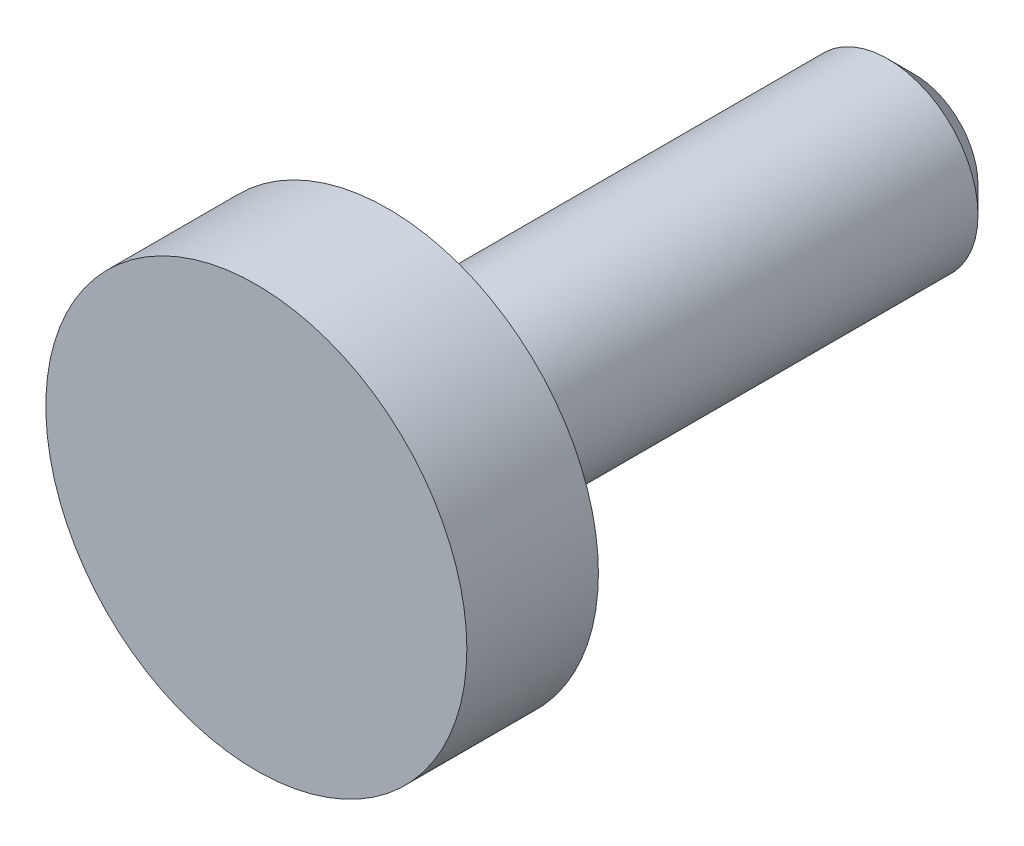
ISO-10303-21;
HEADER;
FILE_DESCRIPTION(('STEP AP214'),'2;1');
FILE_NAME('part.step','',(''),(''),'','','');
FILE_SCHEMA(('AUTOMOTIVE_DESIGN { 1 0 10303 214 1 1 1 1 }'));
ENDSEC;
DATA;
#1=APPLICATION_CONTEXT('core data for automotive mechanical design processes');
#2=APPLICATION_PROTOCOL_DEFINITION('international standard','automotive_design',2000,#1);
#3=PRODUCT_CONTEXT('',#1,'mechanical');
#4=PRODUCT('Part','Part','',(#3));
#5=PRODUCT_RELATED_PRODUCT_CATEGORY('part','',(#4));
#6=PRODUCT_DEFINITION_FORMATION('','',#4);
#7=PRODUCT_DEFINITION_CONTEXT('part definition',#1,'design');
#8=PRODUCT_DEFINITION('design','',#6,#7);
#9=PRODUCT_DEFINITION_SHAPE('','',#8);
#10=(LENGTH_UNIT() NAMED_UNIT(*) SI_UNIT(.MILLI.,.METRE.));
#11=(NAMED_UNIT(*) PLANE_ANGLE_UNIT() SI_UNIT($,.RADIAN.));
#12=(NAMED_UNIT(*) SI_UNIT($,.STERADIAN.) SOLID_ANGLE_UNIT());
#13=UNCERTAINTY_MEASURE_WITH_UNIT(LENGTH_MEASURE(1.E-05),#10,'distance_accuracy_value','');
#14=(GEOMETRIC_REPRESENTATION_CONTEXT(3) GLOBAL_UNCERTAINTY_ASSIGNED_CONTEXT((#13)) GLOBAL_UNIT_ASSIGNED_CONTEXT((#10,
#11,#12)) REPRESENTATION_CONTEXT('',''));
#15=CARTESIAN_POINT('',(0.,0.,0.));
#16=DIRECTION('',(0.,0.,1.));
#17=DIRECTION('',(1.,0.,0.));
#18=AXIS2_PLACEMENT_3D('',#15,#16,#17);
#19=CARTESIAN_POINT('',(0.,0.,20.));
#20=DIRECTION('',(0.,0.,-1.));
#21=DIRECTION('',(-1.,0.,0.));
#22=AXIS2_PLACEMENT_3D('',#19,#20,#21);
#23=CYLINDRICAL_SURFACE('',#22,3.425);
#24=CARTESIAN_POINT('',(0.,0.,1.));
#25=DIRECTION('',(0.,0.,1.));
#26=DIRECTION('',(1.,0.,0.));
#27=AXIS2_PLACEMENT_3D('',#24,#25,#26);
#28=CIRCLE('',#27,3.425);
#29=CARTESIAN_POINT('',(3.425,0.,1.));
#30=VERTEX_POINT('',#29);
#31=EDGE_CURVE('E48',#30,#30,#28,.T.);
#32=ORIENTED_EDGE('',*,*,#31,.T.);
#33=EDGE_LOOP('',(#32));
#34=FACE_BOUND('',#33,.T.);
#35=CARTESIAN_POINT('',(0.,0.,20.));
#36=DIRECTION('',(0.,0.,1.));
#37=DIRECTION('',(1.,0.,0.));
#38=AXIS2_PLACEMENT_3D('',#35,#36,#37);
#39=CIRCLE('',#38,3.425);
#40=CARTESIAN_POINT('',(3.425,0.,20.));
#41=VERTEX_POINT('',#40);
#42=EDGE_CURVE('E53',#41,#41,#39,.T.);
#43=ORIENTED_EDGE('',*,*,#42,.F.);
#44=EDGE_LOOP('',(#43));
#45=FACE_BOUND('',#44,.T.);
#46=ADVANCED_FACE('F39',(#34,#45),#23,.T.);
#47=CARTESIAN_POINT('',(0.,0.,0.));
#48=DIRECTION('',(0.,0.,1.));
#49=DIRECTION('',(1.,0.,0.));
#50=AXIS2_PLACEMENT_3D('',#47,#48,#49);
#51=PLANE('',#50);
#52=CARTESIAN_POINT('',(0.,0.,0.));
#53=DIRECTION('',(0.,0.,1.));
#54=DIRECTION('',(1.,0.,0.));
#55=AXIS2_PLACEMENT_3D('',#52,#53,#54);
#56=CIRCLE('',#55,2.42499999999999);
#57=CARTESIAN_POINT('',(2.42499999999999,0.,0.));
#58=VERTEX_POINT('',#57);
#59=EDGE_CURVE('E10',#58,#58,#56,.F.);
#60=ORIENTED_EDGE('',*,*,#59,.T.);
#61=EDGE_LOOP('',(#60));
#62=FACE_BOUND('',#61,.T.);
#63=ADVANCED_FACE('F74',(#62),#51,.F.);
#64=CARTESIAN_POINT('',(0.,0.,25.));
#65=DIRECTION('',(0.,0.,-1.));
#66=DIRECTION('',(-1.,0.,0.));
#67=AXIS2_PLACEMENT_3D('',#64,#65,#66);
#68=CYLINDRICAL_SURFACE('',#67,8.);
#69=CARTESIAN_POINT('',(0.,0.,25.));
#70=DIRECTION('',(0.,0.,1.));
#71=DIRECTION('',(1.,0.,0.));
#72=AXIS2_PLACEMENT_3D('',#69,#70,#71);
#73=CIRCLE('',#72,8.);
#74=CARTESIAN_POINT('',(8.,0.,25.));
#75=VERTEX_POINT('',#74);
#76=EDGE_CURVE('E58',#75,#75,#73,.T.);
#77=ORIENTED_EDGE('',*,*,#76,.F.);
#78=EDGE_LOOP('',(#77));
#79=FACE_BOUND('',#78,.T.);
#80=CARTESIAN_POINT('',(0.,0.,20.));
#81=DIRECTION('',(0.,0.,1.));
#82=DIRECTION('',(1.,0.,0.));
#83=AXIS2_PLACEMENT_3D('',#80,#81,#82);
#84=CIRCLE('',#83,8.);
#85=CARTESIAN_POINT('',(8.,0.,20.));
#86=VERTEX_POINT('',#85);
#87=EDGE_CURVE('E61',#86,#86,#84,.T.);
#88=ORIENTED_EDGE('',*,*,#87,.T.);
#89=EDGE_LOOP('',(#88));
#90=FACE_BOUND('',#89,.T.);
#91=ADVANCED_FACE('F71',(#79,#90),#68,.T.);
#92=CARTESIAN_POINT('',(0.,0.,25.));
#93=DIRECTION('',(0.,0.,1.));
#94=DIRECTION('',(1.,0.,0.));
#95=AXIS2_PLACEMENT_3D('',#92,#93,#94);
#96=PLANE('',#95);
#97=ORIENTED_EDGE('',*,*,#76,.T.);
#98=EDGE_LOOP('',(#97));
#99=FACE_BOUND('',#98,.T.);
#100=ADVANCED_FACE('F69',(#99),#96,.T.);
#101=CARTESIAN_POINT('',(0.,0.,20.));
#102=DIRECTION('',(0.,0.,1.));
#103=DIRECTION('',(1.,0.,0.));
#104=AXIS2_PLACEMENT_3D('',#101,#102,#103);
#105=PLANE('',#104);
#106=ORIENTED_EDGE('',*,*,#42,.T.);
#107=EDGE_LOOP('',(#106));
#108=FACE_BOUND('',#107,.T.);
#109=ORIENTED_EDGE('',*,*,#87,.F.);
#110=EDGE_LOOP('',(#109));
#111=FACE_BOUND('',#110,.T.);
#112=ADVANCED_FACE('F78',(#108,#111),#105,.F.);
#113=CARTESIAN_POINT('',(0.,0.,1.));
#114=DIRECTION('',(0.,0.,1.));
#115=DIRECTION('',(1.,0.,0.));
#116=AXIS2_PLACEMENT_3D('',#113,#114,#115);
#117=CONICAL_SURFACE('',#116,3.425,0.785398163397449);
#118=ORIENTED_EDGE('',*,*,#59,.F.);
#119=EDGE_LOOP('',(#118));
#120=FACE_BOUND('',#119,.T.);
#121=ORIENTED_EDGE('',*,*,#31,.F.);
#122=EDGE_LOOP('',(#121));
#123=FACE_BOUND('',#122,.T.);
#124=ADVANCED_FACE('F42',(#120,#123),#117,.T.);
#125=CLOSED_SHELL('',(#46,#63,#91,#100,#112,#124));
#126=MANIFOLD_SOLID_BREP('B2',#125);
#127=ADVANCED_BREP_SHAPE_REPRESENTATION('',(#18,#126),#14);
#128=SHAPE_DEFINITION_REPRESENTATION(#9,#127);
ENDSEC;
END-ISO-10303-21;
